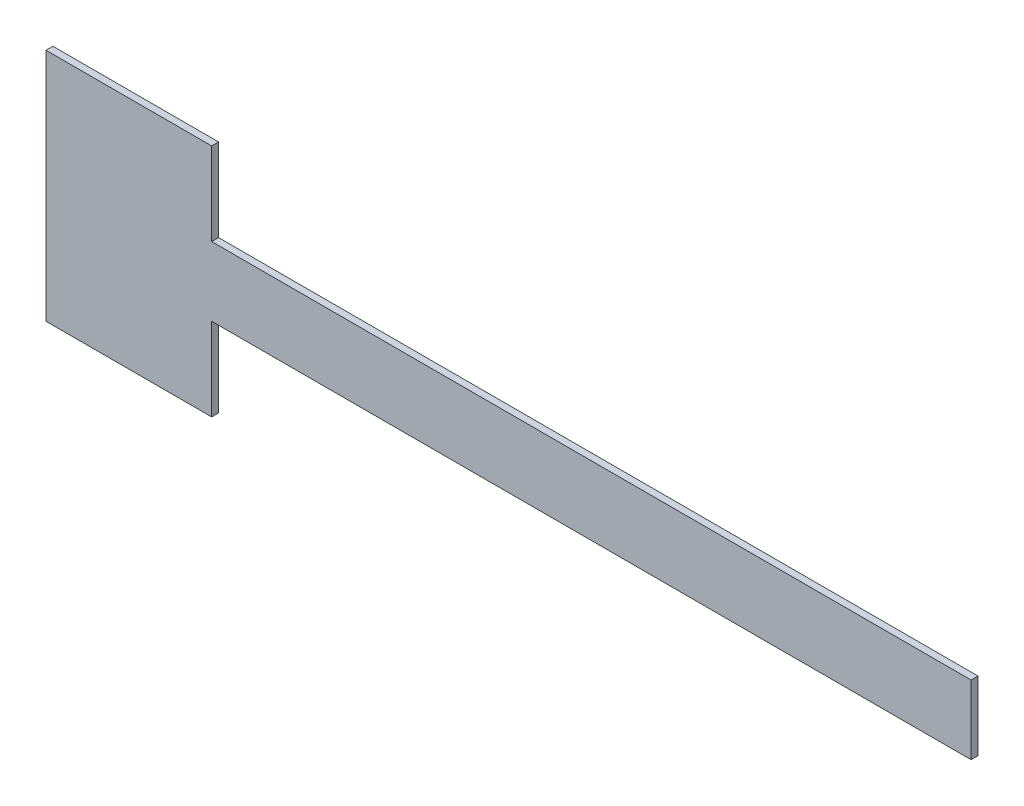
ISO-10303-21;
HEADER;
FILE_DESCRIPTION(('STEP AP214'),'2;1');
FILE_NAME('part.step','',(''),(''),'','','');
FILE_SCHEMA(('AUTOMOTIVE_DESIGN { 1 0 10303 214 1 1 1 1 }'));
ENDSEC;
DATA;
#1=APPLICATION_CONTEXT('core data for automotive mechanical design processes');
#2=APPLICATION_PROTOCOL_DEFINITION('international standard','automotive_design',2000,#1);
#3=PRODUCT_CONTEXT('',#1,'mechanical');
#4=PRODUCT('Part','Part','',(#3));
#5=PRODUCT_RELATED_PRODUCT_CATEGORY('part','',(#4));
#6=PRODUCT_DEFINITION_FORMATION('','',#4);
#7=PRODUCT_DEFINITION_CONTEXT('part definition',#1,'design');
#8=PRODUCT_DEFINITION('design','',#6,#7);
#9=PRODUCT_DEFINITION_SHAPE('','',#8);
#10=(LENGTH_UNIT() NAMED_UNIT(*) SI_UNIT(.MILLI.,.METRE.));
#11=(NAMED_UNIT(*) PLANE_ANGLE_UNIT() SI_UNIT($,.RADIAN.));
#12=(NAMED_UNIT(*) SI_UNIT($,.STERADIAN.) SOLID_ANGLE_UNIT());
#13=UNCERTAINTY_MEASURE_WITH_UNIT(LENGTH_MEASURE(1.E-05),#10,'distance_accuracy_value','');
#14=(GEOMETRIC_REPRESENTATION_CONTEXT(3) GLOBAL_UNCERTAINTY_ASSIGNED_CONTEXT((#13)) GLOBAL_UNIT_ASSIGNED_CONTEXT((#10,
#11,#12)) REPRESENTATION_CONTEXT('',''));
#15=CARTESIAN_POINT('',(0.,0.,0.));
#16=DIRECTION('',(0.,0.,1.));
#17=DIRECTION('',(1.,0.,0.));
#18=AXIS2_PLACEMENT_3D('',#15,#16,#17);
#19=CARTESIAN_POINT('',(0.,0.,0.5));
#20=DIRECTION('',(1.,0.,0.));
#21=DIRECTION('',(0.,0.,-1.));
#22=AXIS2_PLACEMENT_3D('',#19,#20,#21);
#23=PLANE('',#22);
#24=DIRECTION('',(0.,-1.,0.));
#25=VECTOR('',#24,1.);
#26=CARTESIAN_POINT('',(0.,0.,0.));
#27=LINE('',#26,#25);
#28=CARTESIAN_POINT('',(0.,17.,0.));
#29=VERTEX_POINT('',#28);
#30=CARTESIAN_POINT('',(0.,0.,0.));
#31=VERTEX_POINT('',#30);
#32=EDGE_CURVE('E129',#29,#31,#27,.T.);
#33=ORIENTED_EDGE('',*,*,#32,.T.);
#34=DIRECTION('',(0.,0.,-1.));
#35=VECTOR('',#34,1.);
#36=CARTESIAN_POINT('',(0.,0.,0.5));
#37=LINE('',#36,#35);
#38=CARTESIAN_POINT('',(0.,0.,0.5));
#39=VERTEX_POINT('',#38);
#40=EDGE_CURVE('E11',#39,#31,#37,.T.);
#41=ORIENTED_EDGE('',*,*,#40,.F.);
#42=DIRECTION('',(0.,-1.,0.));
#43=VECTOR('',#42,1.);
#44=CARTESIAN_POINT('',(0.,0.,0.5));
#45=LINE('',#44,#43);
#46=CARTESIAN_POINT('',(0.,17.,0.5));
#47=VERTEX_POINT('',#46);
#48=EDGE_CURVE('E143',#47,#39,#45,.T.);
#49=ORIENTED_EDGE('',*,*,#48,.F.);
#50=DIRECTION('',(0.,0.,-1.));
#51=VECTOR('',#50,1.);
#52=CARTESIAN_POINT('',(0.,17.,0.5));
#53=LINE('',#52,#51);
#54=EDGE_CURVE('E125',#47,#29,#53,.T.);
#55=ORIENTED_EDGE('',*,*,#54,.T.);
#56=EDGE_LOOP('',(#33,#41,#49,#55));
#57=FACE_BOUND('',#56,.T.);
#58=ADVANCED_FACE('F33',(#57),#23,.F.);
#59=CARTESIAN_POINT('',(0.,0.,0.5));
#60=DIRECTION('',(0.,1.,0.));
#61=DIRECTION('',(0.,0.,1.));
#62=AXIS2_PLACEMENT_3D('',#59,#60,#61);
#63=PLANE('',#62);
#64=DIRECTION('',(1.,0.,0.));
#65=VECTOR('',#64,1.);
#66=CARTESIAN_POINT('',(0.,0.,0.));
#67=LINE('',#66,#65);
#68=CARTESIAN_POINT('',(12.,0.,0.));
#69=VERTEX_POINT('',#68);
#70=EDGE_CURVE('E132',#31,#69,#67,.T.);
#71=ORIENTED_EDGE('',*,*,#70,.T.);
#72=DIRECTION('',(0.,0.,-1.));
#73=VECTOR('',#72,1.);
#74=CARTESIAN_POINT('',(12.,0.,0.5));
#75=LINE('',#74,#73);
#76=CARTESIAN_POINT('',(12.,0.,0.5));
#77=VERTEX_POINT('',#76);
#78=EDGE_CURVE('E41',#77,#69,#75,.T.);
#79=ORIENTED_EDGE('',*,*,#78,.F.);
#80=DIRECTION('',(1.,0.,0.));
#81=VECTOR('',#80,1.);
#82=CARTESIAN_POINT('',(0.,0.,0.5));
#83=LINE('',#82,#81);
#84=EDGE_CURVE('E92',#39,#77,#83,.T.);
#85=ORIENTED_EDGE('',*,*,#84,.F.);
#86=ORIENTED_EDGE('',*,*,#40,.T.);
#87=EDGE_LOOP('',(#71,#79,#85,#86));
#88=FACE_BOUND('',#87,.T.);
#89=ADVANCED_FACE('F178',(#88),#63,.F.);
#90=CARTESIAN_POINT('',(12.,0.,0.5));
#91=DIRECTION('',(-1.,0.,0.));
#92=DIRECTION('',(0.,-1.,0.));
#93=AXIS2_PLACEMENT_3D('',#90,#91,#92);
#94=PLANE('',#93);
#95=DIRECTION('',(0.,1.,0.));
#96=VECTOR('',#95,1.);
#97=CARTESIAN_POINT('',(12.,0.,0.));
#98=LINE('',#97,#96);
#99=CARTESIAN_POINT('',(12.,6.,0.));
#100=VERTEX_POINT('',#99);
#101=EDGE_CURVE('E134',#69,#100,#98,.T.);
#102=ORIENTED_EDGE('',*,*,#101,.T.);
#103=DIRECTION('',(0.,0.,-1.));
#104=VECTOR('',#103,1.);
#105=CARTESIAN_POINT('',(12.,6.,0.5));
#106=LINE('',#105,#104);
#107=CARTESIAN_POINT('',(12.,6.,0.5));
#108=VERTEX_POINT('',#107);
#109=EDGE_CURVE('E150',#108,#100,#106,.T.);
#110=ORIENTED_EDGE('',*,*,#109,.F.);
#111=DIRECTION('',(0.,1.,0.));
#112=VECTOR('',#111,1.);
#113=CARTESIAN_POINT('',(12.,0.,0.5));
#114=LINE('',#113,#112);
#115=EDGE_CURVE('E158',#77,#108,#114,.T.);
#116=ORIENTED_EDGE('',*,*,#115,.F.);
#117=ORIENTED_EDGE('',*,*,#78,.T.);
#118=EDGE_LOOP('',(#102,#110,#116,#117));
#119=FACE_BOUND('',#118,.T.);
#120=ADVANCED_FACE('F156',(#119),#94,.F.);
#121=CARTESIAN_POINT('',(12.,6.,0.5));
#122=DIRECTION('',(0.,1.,0.));
#123=DIRECTION('',(-1.,0.,0.));
#124=AXIS2_PLACEMENT_3D('',#121,#122,#123);
#125=PLANE('',#124);
#126=DIRECTION('',(1.,0.,0.));
#127=VECTOR('',#126,1.);
#128=CARTESIAN_POINT('',(12.,6.,0.));
#129=LINE('',#128,#127);
#130=CARTESIAN_POINT('',(67.,6.00000000000001,0.));
#131=VERTEX_POINT('',#130);
#132=EDGE_CURVE('E136',#100,#131,#129,.T.);
#133=ORIENTED_EDGE('',*,*,#132,.T.);
#134=DIRECTION('',(0.,0.,-1.));
#135=VECTOR('',#134,1.);
#136=CARTESIAN_POINT('',(67.,6.00000000000001,0.5));
#137=LINE('',#136,#135);
#138=CARTESIAN_POINT('',(67.,6.00000000000001,0.5));
#139=VERTEX_POINT('',#138);
#140=EDGE_CURVE('E147',#139,#131,#137,.T.);
#141=ORIENTED_EDGE('',*,*,#140,.F.);
#142=DIRECTION('',(1.,0.,0.));
#143=VECTOR('',#142,1.);
#144=CARTESIAN_POINT('',(12.,6.,0.5));
#145=LINE('',#144,#143);
#146=EDGE_CURVE('E170',#108,#139,#145,.T.);
#147=ORIENTED_EDGE('',*,*,#146,.F.);
#148=ORIENTED_EDGE('',*,*,#109,.T.);
#149=EDGE_LOOP('',(#133,#141,#147,#148));
#150=FACE_BOUND('',#149,.T.);
#151=ADVANCED_FACE('F166',(#150),#125,.F.);
#152=CARTESIAN_POINT('',(67.,11.,0.5));
#153=DIRECTION('',(-1.,0.,0.));
#154=DIRECTION('',(0.,0.,1.));
#155=AXIS2_PLACEMENT_3D('',#152,#153,#154);
#156=PLANE('',#155);
#157=DIRECTION('',(0.,1.,0.));
#158=VECTOR('',#157,1.);
#159=CARTESIAN_POINT('',(67.,11.,0.));
#160=LINE('',#159,#158);
#161=CARTESIAN_POINT('',(67.,11.,0.));
#162=VERTEX_POINT('',#161);
#163=EDGE_CURVE('E138',#131,#162,#160,.T.);
#164=ORIENTED_EDGE('',*,*,#163,.T.);
#165=DIRECTION('',(0.,0.,-1.));
#166=VECTOR('',#165,1.);
#167=CARTESIAN_POINT('',(67.,11.,0.5));
#168=LINE('',#167,#166);
#169=CARTESIAN_POINT('',(67.,11.,0.5));
#170=VERTEX_POINT('',#169);
#171=EDGE_CURVE('E120',#170,#162,#168,.T.);
#172=ORIENTED_EDGE('',*,*,#171,.F.);
#173=DIRECTION('',(0.,1.,0.));
#174=VECTOR('',#173,1.);
#175=CARTESIAN_POINT('',(67.,11.,0.5));
#176=LINE('',#175,#174);
#177=EDGE_CURVE('E111',#139,#170,#176,.T.);
#178=ORIENTED_EDGE('',*,*,#177,.F.);
#179=ORIENTED_EDGE('',*,*,#140,.T.);
#180=EDGE_LOOP('',(#164,#172,#178,#179));
#181=FACE_BOUND('',#180,.T.);
#182=ADVANCED_FACE('F169',(#181),#156,.F.);
#183=CARTESIAN_POINT('',(12.,11.,0.5));
#184=DIRECTION('',(0.,-1.,0.));
#185=DIRECTION('',(1.,0.,0.));
#186=AXIS2_PLACEMENT_3D('',#183,#184,#185);
#187=PLANE('',#186);
#188=DIRECTION('',(-1.,0.,0.));
#189=VECTOR('',#188,1.);
#190=CARTESIAN_POINT('',(12.,11.,0.));
#191=LINE('',#190,#189);
#192=CARTESIAN_POINT('',(12.,11.,0.));
#193=VERTEX_POINT('',#192);
#194=EDGE_CURVE('E119',#162,#193,#191,.T.);
#195=ORIENTED_EDGE('',*,*,#194,.T.);
#196=DIRECTION('',(0.,0.,-1.));
#197=VECTOR('',#196,1.);
#198=CARTESIAN_POINT('',(12.,11.,0.5));
#199=LINE('',#198,#197);
#200=CARTESIAN_POINT('',(12.,11.,0.5));
#201=VERTEX_POINT('',#200);
#202=EDGE_CURVE('E116',#201,#193,#199,.T.);
#203=ORIENTED_EDGE('',*,*,#202,.F.);
#204=DIRECTION('',(-1.,0.,0.));
#205=VECTOR('',#204,1.);
#206=CARTESIAN_POINT('',(12.,11.,0.5));
#207=LINE('',#206,#205);
#208=EDGE_CURVE('E105',#170,#201,#207,.T.);
#209=ORIENTED_EDGE('',*,*,#208,.F.);
#210=ORIENTED_EDGE('',*,*,#171,.T.);
#211=EDGE_LOOP('',(#195,#203,#209,#210));
#212=FACE_BOUND('',#211,.T.);
#213=ADVANCED_FACE('F117',(#212),#187,.F.);
#214=CARTESIAN_POINT('',(12.,11.,0.5));
#215=DIRECTION('',(-1.,0.,0.));
#216=DIRECTION('',(0.,-1.,0.));
#217=AXIS2_PLACEMENT_3D('',#214,#215,#216);
#218=PLANE('',#217);
#219=DIRECTION('',(0.,1.,0.));
#220=VECTOR('',#219,1.);
#221=CARTESIAN_POINT('',(12.,11.,0.));
#222=LINE('',#221,#220);
#223=CARTESIAN_POINT('',(12.,17.,0.));
#224=VERTEX_POINT('',#223);
#225=EDGE_CURVE('E78',#193,#224,#222,.T.);
#226=ORIENTED_EDGE('',*,*,#225,.T.);
#227=DIRECTION('',(0.,0.,-1.));
#228=VECTOR('',#227,1.);
#229=CARTESIAN_POINT('',(12.,17.,0.5));
#230=LINE('',#229,#228);
#231=CARTESIAN_POINT('',(12.,17.,0.5));
#232=VERTEX_POINT('',#231);
#233=EDGE_CURVE('E121',#232,#224,#230,.T.);
#234=ORIENTED_EDGE('',*,*,#233,.F.);
#235=DIRECTION('',(0.,1.,0.));
#236=VECTOR('',#235,1.);
#237=CARTESIAN_POINT('',(12.,11.,0.5));
#238=LINE('',#237,#236);
#239=EDGE_CURVE('E109',#201,#232,#238,.T.);
#240=ORIENTED_EDGE('',*,*,#239,.F.);
#241=ORIENTED_EDGE('',*,*,#202,.T.);
#242=EDGE_LOOP('',(#226,#234,#240,#241));
#243=FACE_BOUND('',#242,.T.);
#244=ADVANCED_FACE('F123',(#243),#218,.F.);
#245=CARTESIAN_POINT('',(0.,17.,0.5));
#246=DIRECTION('',(0.,-1.,0.));
#247=DIRECTION('',(0.,0.,-1.));
#248=AXIS2_PLACEMENT_3D('',#245,#246,#247);
#249=PLANE('',#248);
#250=DIRECTION('',(-1.,0.,0.));
#251=VECTOR('',#250,1.);
#252=CARTESIAN_POINT('',(0.,17.,0.));
#253=LINE('',#252,#251);
#254=EDGE_CURVE('E84',#224,#29,#253,.T.);
#255=ORIENTED_EDGE('',*,*,#254,.T.);
#256=ORIENTED_EDGE('',*,*,#54,.F.);
#257=DIRECTION('',(-1.,0.,0.));
#258=VECTOR('',#257,1.);
#259=CARTESIAN_POINT('',(0.,17.,0.5));
#260=LINE('',#259,#258);
#261=EDGE_CURVE('E49',#232,#47,#260,.T.);
#262=ORIENTED_EDGE('',*,*,#261,.F.);
#263=ORIENTED_EDGE('',*,*,#233,.T.);
#264=EDGE_LOOP('',(#255,#256,#262,#263));
#265=FACE_BOUND('',#264,.T.);
#266=ADVANCED_FACE('F194',(#265),#249,.F.);
#267=CARTESIAN_POINT('',(0.,0.,0.5));
#268=DIRECTION('',(0.,0.,-1.));
#269=DIRECTION('',(-1.,0.,0.));
#270=AXIS2_PLACEMENT_3D('',#267,#268,#269);
#271=PLANE('',#270);
#272=ORIENTED_EDGE('',*,*,#48,.T.);
#273=ORIENTED_EDGE('',*,*,#84,.T.);
#274=ORIENTED_EDGE('',*,*,#115,.T.);
#275=ORIENTED_EDGE('',*,*,#146,.T.);
#276=ORIENTED_EDGE('',*,*,#177,.T.);
#277=ORIENTED_EDGE('',*,*,#208,.T.);
#278=ORIENTED_EDGE('',*,*,#239,.T.);
#279=ORIENTED_EDGE('',*,*,#261,.T.);
#280=EDGE_LOOP('',(#272,#273,#274,#275,#276,#277,#278,#279));
#281=FACE_BOUND('',#280,.T.);
#282=ADVANCED_FACE('F107',(#281),#271,.F.);
#283=CARTESIAN_POINT('',(0.,0.,0.));
#284=DIRECTION('',(0.,0.,-1.));
#285=DIRECTION('',(-1.,0.,0.));
#286=AXIS2_PLACEMENT_3D('',#283,#284,#285);
#287=PLANE('',#286);
#288=ORIENTED_EDGE('',*,*,#32,.F.);
#289=ORIENTED_EDGE('',*,*,#254,.F.);
#290=ORIENTED_EDGE('',*,*,#225,.F.);
#291=ORIENTED_EDGE('',*,*,#194,.F.);
#292=ORIENTED_EDGE('',*,*,#163,.F.);
#293=ORIENTED_EDGE('',*,*,#132,.F.);
#294=ORIENTED_EDGE('',*,*,#101,.F.);
#295=ORIENTED_EDGE('',*,*,#70,.F.);
#296=EDGE_LOOP('',(#288,#289,#290,#291,#292,#293,#294,#295));
#297=FACE_BOUND('',#296,.T.);
#298=ADVANCED_FACE('F162',(#297),#287,.T.);
#299=CLOSED_SHELL('',(#58,#89,#120,#151,#182,#213,#244,#266,#282,#298));
#300=MANIFOLD_SOLID_BREP('B2',#299);
#301=ADVANCED_BREP_SHAPE_REPRESENTATION('',(#18,#300),#14);
#302=SHAPE_DEFINITION_REPRESENTATION(#9,#301);
ENDSEC;
END-ISO-10303-21;
